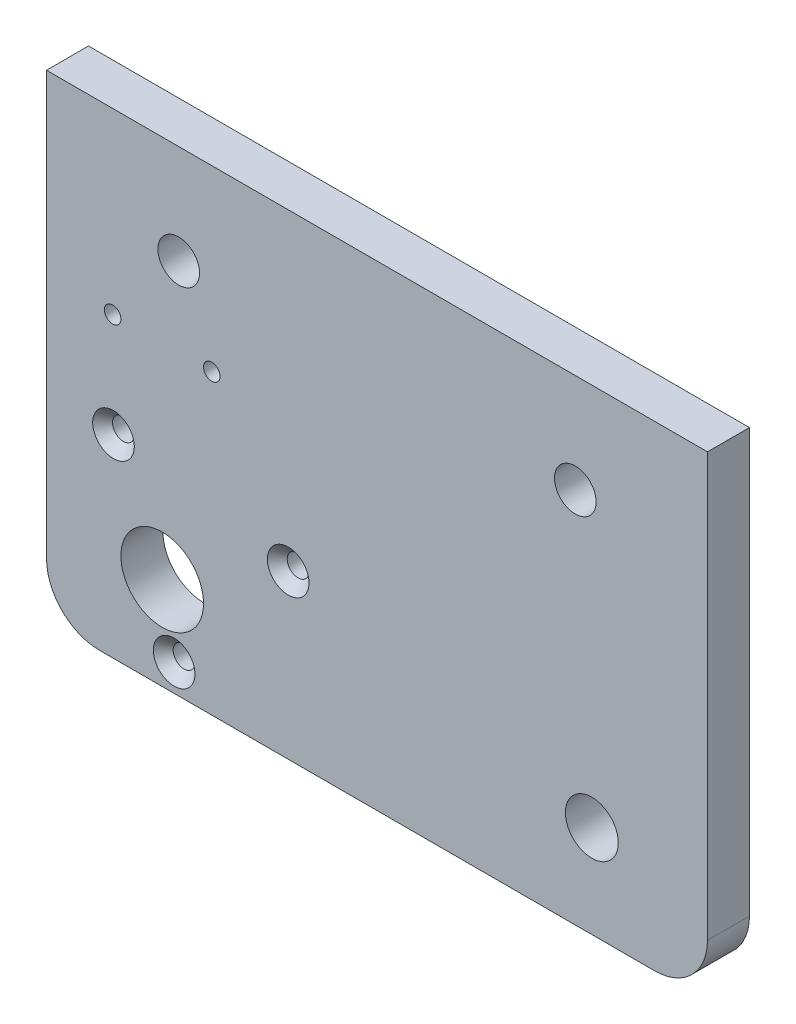
ISO-10303-21;
HEADER;
FILE_DESCRIPTION(('STEP AP214'),'2;1');
FILE_NAME('part.step','',(''),(''),'','','');
FILE_SCHEMA(('AUTOMOTIVE_DESIGN { 1 0 10303 214 1 1 1 1 }'));
ENDSEC;
DATA;
#1=APPLICATION_CONTEXT('core data for automotive mechanical design processes');
#2=APPLICATION_PROTOCOL_DEFINITION('international standard','automotive_design',2000,#1);
#3=PRODUCT_CONTEXT('',#1,'mechanical');
#4=PRODUCT('Part','Part','',(#3));
#5=PRODUCT_RELATED_PRODUCT_CATEGORY('part','',(#4));
#6=PRODUCT_DEFINITION_FORMATION('','',#4);
#7=PRODUCT_DEFINITION_CONTEXT('part definition',#1,'design');
#8=PRODUCT_DEFINITION('design','',#6,#7);
#9=PRODUCT_DEFINITION_SHAPE('','',#8);
#10=(LENGTH_UNIT() NAMED_UNIT(*) SI_UNIT(.MILLI.,.METRE.));
#11=(NAMED_UNIT(*) PLANE_ANGLE_UNIT() SI_UNIT($,.RADIAN.));
#12=(NAMED_UNIT(*) SI_UNIT($,.STERADIAN.) SOLID_ANGLE_UNIT());
#13=UNCERTAINTY_MEASURE_WITH_UNIT(LENGTH_MEASURE(1.E-05),#10,'distance_accuracy_value','');
#14=(GEOMETRIC_REPRESENTATION_CONTEXT(3) GLOBAL_UNCERTAINTY_ASSIGNED_CONTEXT((#13)) GLOBAL_UNIT_ASSIGNED_CONTEXT((#10,
#11,#12)) REPRESENTATION_CONTEXT('',''));
#15=CARTESIAN_POINT('',(0.,0.,0.));
#16=DIRECTION('',(0.,0.,1.));
#17=DIRECTION('',(1.,0.,0.));
#18=AXIS2_PLACEMENT_3D('',#15,#16,#17);
#19=CARTESIAN_POINT('',(0.,0.,6.35));
#20=DIRECTION('',(1.,0.,0.));
#21=DIRECTION('',(0.,0.,-1.));
#22=AXIS2_PLACEMENT_3D('',#19,#20,#21);
#23=PLANE('',#22);
#24=DIRECTION('',(0.,-1.,0.));
#25=VECTOR('',#24,1.);
#26=CARTESIAN_POINT('',(0.,0.,0.));
#27=LINE('',#26,#25);
#28=CARTESIAN_POINT('',(0.,72.,0.));
#29=VERTEX_POINT('',#28);
#30=CARTESIAN_POINT('',(0.,8.,0.));
#31=VERTEX_POINT('',#30);
#32=EDGE_CURVE('E117',#29,#31,#27,.T.);
#33=ORIENTED_EDGE('',*,*,#32,.T.);
#34=DIRECTION('',(0.,0.,-1.));
#35=VECTOR('',#34,1.);
#36=CARTESIAN_POINT('',(0.,8.,6.35));
#37=LINE('',#36,#35);
#38=CARTESIAN_POINT('',(0.,8.,6.35));
#39=VERTEX_POINT('',#38);
#40=EDGE_CURVE('E47',#31,#39,#37,.F.);
#41=ORIENTED_EDGE('',*,*,#40,.T.);
#42=DIRECTION('',(0.,-1.,0.));
#43=VECTOR('',#42,1.);
#44=CARTESIAN_POINT('',(0.,0.,6.35));
#45=LINE('',#44,#43);
#46=CARTESIAN_POINT('',(0.,72.,6.35));
#47=VERTEX_POINT('',#46);
#48=EDGE_CURVE('E124',#47,#39,#45,.T.);
#49=ORIENTED_EDGE('',*,*,#48,.F.);
#50=DIRECTION('',(0.,0.,-1.));
#51=VECTOR('',#50,1.);
#52=CARTESIAN_POINT('',(0.,72.,6.35));
#53=LINE('',#52,#51);
#54=EDGE_CURVE('E109',#47,#29,#53,.T.);
#55=ORIENTED_EDGE('',*,*,#54,.T.);
#56=EDGE_LOOP('',(#33,#41,#49,#55));
#57=FACE_BOUND('',#56,.T.);
#58=ADVANCED_FACE('F32',(#57),#23,.F.);
#59=CARTESIAN_POINT('',(0.,0.,6.35));
#60=DIRECTION('',(0.,1.,0.));
#61=DIRECTION('',(0.,0.,1.));
#62=AXIS2_PLACEMENT_3D('',#59,#60,#61);
#63=PLANE('',#62);
#64=DIRECTION('',(1.,0.,0.));
#65=VECTOR('',#64,1.);
#66=CARTESIAN_POINT('',(0.,0.,0.));
#67=LINE('',#66,#65);
#68=CARTESIAN_POINT('',(8.,0.,0.));
#69=VERTEX_POINT('',#68);
#70=CARTESIAN_POINT('',(92.,0.,0.));
#71=VERTEX_POINT('',#70);
#72=EDGE_CURVE('E119',#69,#71,#67,.T.);
#73=ORIENTED_EDGE('',*,*,#72,.T.);
#74=DIRECTION('',(0.,0.,-1.));
#75=VECTOR('',#74,1.);
#76=CARTESIAN_POINT('',(92.,0.,6.35));
#77=LINE('',#76,#75);
#78=CARTESIAN_POINT('',(92.,0.,6.35));
#79=VERTEX_POINT('',#78);
#80=EDGE_CURVE('E55',#71,#79,#77,.F.);
#81=ORIENTED_EDGE('',*,*,#80,.T.);
#82=DIRECTION('',(1.,0.,0.));
#83=VECTOR('',#82,1.);
#84=CARTESIAN_POINT('',(0.,0.,6.35));
#85=LINE('',#84,#83);
#86=CARTESIAN_POINT('',(8.,0.,6.35));
#87=VERTEX_POINT('',#86);
#88=EDGE_CURVE('E99',#87,#79,#85,.T.);
#89=ORIENTED_EDGE('',*,*,#88,.F.);
#90=DIRECTION('',(0.,0.,-1.));
#91=VECTOR('',#90,1.);
#92=CARTESIAN_POINT('',(8.,0.,6.35));
#93=LINE('',#92,#91);
#94=EDGE_CURVE('E131',#87,#69,#93,.T.);
#95=ORIENTED_EDGE('',*,*,#94,.T.);
#96=EDGE_LOOP('',(#73,#81,#89,#95));
#97=FACE_BOUND('',#96,.T.);
#98=ADVANCED_FACE('F196',(#97),#63,.F.);
#99=CARTESIAN_POINT('',(100.,0.,6.35));
#100=DIRECTION('',(-1.,0.,0.));
#101=DIRECTION('',(0.,0.,1.));
#102=AXIS2_PLACEMENT_3D('',#99,#100,#101);
#103=PLANE('',#102);
#104=DIRECTION('',(0.,1.,0.));
#105=VECTOR('',#104,1.);
#106=CARTESIAN_POINT('',(100.,0.,6.35));
#107=LINE('',#106,#105);
#108=CARTESIAN_POINT('',(100.,8.,6.35));
#109=VERTEX_POINT('',#108);
#110=CARTESIAN_POINT('',(100.,72.,6.35));
#111=VERTEX_POINT('',#110);
#112=EDGE_CURVE('E88',#109,#111,#107,.T.);
#113=ORIENTED_EDGE('',*,*,#112,.F.);
#114=DIRECTION('',(0.,0.,-1.));
#115=VECTOR('',#114,1.);
#116=CARTESIAN_POINT('',(100.,8.,6.35));
#117=LINE('',#116,#115);
#118=CARTESIAN_POINT('',(100.,8.,0.));
#119=VERTEX_POINT('',#118);
#120=EDGE_CURVE('E108',#109,#119,#117,.T.);
#121=ORIENTED_EDGE('',*,*,#120,.T.);
#122=DIRECTION('',(0.,1.,0.));
#123=VECTOR('',#122,1.);
#124=CARTESIAN_POINT('',(100.,0.,0.));
#125=LINE('',#124,#123);
#126=CARTESIAN_POINT('',(100.,72.,0.));
#127=VERTEX_POINT('',#126);
#128=EDGE_CURVE('E105',#119,#127,#125,.T.);
#129=ORIENTED_EDGE('',*,*,#128,.T.);
#130=DIRECTION('',(0.,0.,-1.));
#131=VECTOR('',#130,1.);
#132=CARTESIAN_POINT('',(100.,72.,6.35));
#133=LINE('',#132,#131);
#134=EDGE_CURVE('E102',#111,#127,#133,.T.);
#135=ORIENTED_EDGE('',*,*,#134,.F.);
#136=EDGE_LOOP('',(#113,#121,#129,#135));
#137=FACE_BOUND('',#136,.T.);
#138=ADVANCED_FACE('F103',(#137),#103,.F.);
#139=CARTESIAN_POINT('',(0.,72.,6.35));
#140=DIRECTION('',(0.,-1.,0.));
#141=DIRECTION('',(0.,0.,-1.));
#142=AXIS2_PLACEMENT_3D('',#139,#140,#141);
#143=PLANE('',#142);
#144=DIRECTION('',(-1.,0.,0.));
#145=VECTOR('',#144,1.);
#146=CARTESIAN_POINT('',(0.,72.,0.));
#147=LINE('',#146,#145);
#148=EDGE_CURVE('E123',#127,#29,#147,.T.);
#149=ORIENTED_EDGE('',*,*,#148,.T.);
#150=ORIENTED_EDGE('',*,*,#54,.F.);
#151=DIRECTION('',(-1.,0.,0.));
#152=VECTOR('',#151,1.);
#153=CARTESIAN_POINT('',(0.,72.,6.35));
#154=LINE('',#153,#152);
#155=EDGE_CURVE('E92',#111,#47,#154,.T.);
#156=ORIENTED_EDGE('',*,*,#155,.F.);
#157=ORIENTED_EDGE('',*,*,#134,.T.);
#158=EDGE_LOOP('',(#149,#150,#156,#157));
#159=FACE_BOUND('',#158,.T.);
#160=ADVANCED_FACE('F111',(#159),#143,.F.);
#161=CARTESIAN_POINT('',(0.,0.,6.35));
#162=DIRECTION('',(0.,0.,-1.));
#163=DIRECTION('',(-1.,0.,0.));
#164=AXIS2_PLACEMENT_3D('',#161,#162,#163);
#165=PLANE('',#164);
#166=CARTESIAN_POINT('',(19.3084532461626,4.09738247569258,6.35));
#167=DIRECTION('',(0.,0.,-1.));
#168=DIRECTION('',(-1.,0.,0.));
#169=AXIS2_PLACEMENT_3D('',#166,#167,#168);
#170=CIRCLE('',#169,3.15000000000001);
#171=CARTESIAN_POINT('',(16.1584532461626,4.09738247569258,6.35));
#172=VERTEX_POINT('',#171);
#173=EDGE_CURVE('E11',#172,#172,#170,.T.);
#174=ORIENTED_EDGE('',*,*,#173,.T.);
#175=EDGE_LOOP('',(#174));
#176=FACE_BOUND('',#175,.T.);
#177=CARTESIAN_POINT('',(36.5652356221816,24.6632148689297,6.35));
#178=DIRECTION('',(0.,0.,-1.));
#179=DIRECTION('',(-1.,0.,0.));
#180=AXIS2_PLACEMENT_3D('',#177,#178,#179);
#181=CIRCLE('',#180,3.15000000000001);
#182=CARTESIAN_POINT('',(33.4152356221816,24.6632148689297,6.35));
#183=VERTEX_POINT('',#182);
#184=EDGE_CURVE('E40',#183,#183,#181,.T.);
#185=ORIENTED_EDGE('',*,*,#184,.T.);
#186=EDGE_LOOP('',(#185));
#187=FACE_BOUND('',#186,.T.);
#188=CARTESIAN_POINT('',(10.1263111316559,29.3251105975232,6.35));
#189=DIRECTION('',(0.,0.,-1.));
#190=DIRECTION('',(-1.,0.,0.));
#191=AXIS2_PLACEMENT_3D('',#188,#189,#190);
#192=CIRCLE('',#191,3.15000000000001);
#193=CARTESIAN_POINT('',(6.97631113165584,29.3251105975232,6.35));
#194=VERTEX_POINT('',#193);
#195=EDGE_CURVE('E166',#194,#194,#192,.T.);
#196=ORIENTED_EDGE('',*,*,#195,.T.);
#197=EDGE_LOOP('',(#196));
#198=FACE_BOUND('',#197,.T.);
#199=CARTESIAN_POINT('',(82.5,14.,6.35));
#200=DIRECTION('',(0.,0.,1.));
#201=DIRECTION('',(1.,0.,0.));
#202=AXIS2_PLACEMENT_3D('',#199,#200,#201);
#203=CIRCLE('',#202,4.00000000000001);
#204=CARTESIAN_POINT('',(86.5,14.,6.35));
#205=VERTEX_POINT('',#204);
#206=EDGE_CURVE('E392',#205,#205,#203,.T.);
#207=ORIENTED_EDGE('',*,*,#206,.F.);
#208=EDGE_LOOP('',(#207));
#209=FACE_BOUND('',#208,.T.);
#210=CARTESIAN_POINT('',(80.,57.,6.35));
#211=DIRECTION('',(0.,0.,1.));
#212=DIRECTION('',(1.,0.,0.));
#213=AXIS2_PLACEMENT_3D('',#210,#211,#212);
#214=CIRCLE('',#213,3.15);
#215=CARTESIAN_POINT('',(83.15,57.,6.35));
#216=VERTEX_POINT('',#215);
#217=EDGE_CURVE('E396',#216,#216,#214,.T.);
#218=ORIENTED_EDGE('',*,*,#217,.F.);
#219=EDGE_LOOP('',(#218));
#220=FACE_BOUND('',#219,.T.);
#221=CARTESIAN_POINT('',(20.,57.,6.35));
#222=DIRECTION('',(0.,0.,1.));
#223=DIRECTION('',(1.,0.,0.));
#224=AXIS2_PLACEMENT_3D('',#221,#222,#223);
#225=CIRCLE('',#224,3.15);
#226=CARTESIAN_POINT('',(23.15,57.,6.35));
#227=VERTEX_POINT('',#226);
#228=EDGE_CURVE('E400',#227,#227,#225,.T.);
#229=ORIENTED_EDGE('',*,*,#228,.F.);
#230=EDGE_LOOP('',(#229));
#231=FACE_BOUND('',#230,.T.);
#232=CARTESIAN_POINT('',(10.,45.,6.35));
#233=DIRECTION('',(0.,0.,1.));
#234=DIRECTION('',(1.,0.,0.));
#235=AXIS2_PLACEMENT_3D('',#232,#233,#234);
#236=CIRCLE('',#235,1.25);
#237=CARTESIAN_POINT('',(11.25,45.,6.35));
#238=VERTEX_POINT('',#237);
#239=EDGE_CURVE('E404',#238,#238,#236,.T.);
#240=ORIENTED_EDGE('',*,*,#239,.F.);
#241=EDGE_LOOP('',(#240));
#242=FACE_BOUND('',#241,.T.);
#243=CARTESIAN_POINT('',(25.,45.,6.35));
#244=DIRECTION('',(0.,0.,1.));
#245=DIRECTION('',(1.,0.,0.));
#246=AXIS2_PLACEMENT_3D('',#243,#244,#245);
#247=CIRCLE('',#246,1.25);
#248=CARTESIAN_POINT('',(26.25,45.,6.35));
#249=VERTEX_POINT('',#248);
#250=EDGE_CURVE('E408',#249,#249,#247,.T.);
#251=ORIENTED_EDGE('',*,*,#250,.F.);
#252=EDGE_LOOP('',(#251));
#253=FACE_BOUND('',#252,.T.);
#254=CARTESIAN_POINT('',(17.5,14.,6.35));
#255=DIRECTION('',(0.,0.,1.));
#256=DIRECTION('',(1.,0.,0.));
#257=AXIS2_PLACEMENT_3D('',#254,#255,#256);
#258=CIRCLE('',#257,6.25);
#259=CARTESIAN_POINT('',(23.75,14.,6.35));
#260=VERTEX_POINT('',#259);
#261=EDGE_CURVE('E120',#260,#260,#258,.T.);
#262=ORIENTED_EDGE('',*,*,#261,.F.);
#263=EDGE_LOOP('',(#262));
#264=FACE_BOUND('',#263,.T.);
#265=ORIENTED_EDGE('',*,*,#88,.T.);
#266=CARTESIAN_POINT('',(92.,8.,6.35));
#267=DIRECTION('',(0.,0.,-1.));
#268=DIRECTION('',(-1.,0.,0.));
#269=AXIS2_PLACEMENT_3D('',#266,#267,#268);
#270=CIRCLE('',#269,8.);
#271=EDGE_CURVE('E95',#79,#109,#270,.F.);
#272=ORIENTED_EDGE('',*,*,#271,.T.);
#273=ORIENTED_EDGE('',*,*,#112,.T.);
#274=ORIENTED_EDGE('',*,*,#155,.T.);
#275=ORIENTED_EDGE('',*,*,#48,.T.);
#276=CARTESIAN_POINT('',(8.,8.,6.35));
#277=DIRECTION('',(0.,0.,-1.));
#278=DIRECTION('',(-1.,0.,0.));
#279=AXIS2_PLACEMENT_3D('',#276,#277,#278);
#280=CIRCLE('',#279,8.);
#281=EDGE_CURVE('E135',#39,#87,#280,.F.);
#282=ORIENTED_EDGE('',*,*,#281,.T.);
#283=EDGE_LOOP('',(#265,#272,#273,#274,#275,#282));
#284=FACE_BOUND('',#283,.T.);
#285=ADVANCED_FACE('F90',(#176,#187,#198,#209,#220,#231,#242,#253,#264,#284),#165,.F.);
#286=CARTESIAN_POINT('',(0.,0.,0.));
#287=DIRECTION('',(0.,0.,-1.));
#288=DIRECTION('',(-1.,0.,0.));
#289=AXIS2_PLACEMENT_3D('',#286,#287,#288);
#290=PLANE('',#289);
#291=CARTESIAN_POINT('',(19.3084532461626,4.09738247569258,0.));
#292=DIRECTION('',(0.,0.,-1.));
#293=DIRECTION('',(-1.,0.,0.));
#294=AXIS2_PLACEMENT_3D('',#291,#292,#293);
#295=CIRCLE('',#294,3.15);
#296=CARTESIAN_POINT('',(16.1584532461626,4.09738247569258,0.));
#297=VERTEX_POINT('',#296);
#298=EDGE_CURVE('E145',#297,#297,#295,.F.);
#299=ORIENTED_EDGE('',*,*,#298,.T.);
#300=EDGE_LOOP('',(#299));
#301=FACE_BOUND('',#300,.T.);
#302=CARTESIAN_POINT('',(10.1263111316559,29.3251105975232,0.));
#303=DIRECTION('',(0.,0.,-1.));
#304=DIRECTION('',(-1.,0.,0.));
#305=AXIS2_PLACEMENT_3D('',#302,#303,#304);
#306=CIRCLE('',#305,3.14999999999997);
#307=CARTESIAN_POINT('',(6.97631113165588,29.3251105975232,0.));
#308=VERTEX_POINT('',#307);
#309=EDGE_CURVE('E142',#308,#308,#306,.F.);
#310=ORIENTED_EDGE('',*,*,#309,.T.);
#311=EDGE_LOOP('',(#310));
#312=FACE_BOUND('',#311,.T.);
#313=CARTESIAN_POINT('',(36.5652356221816,24.6632148689297,0.));
#314=DIRECTION('',(0.,0.,-1.));
#315=DIRECTION('',(-1.,0.,0.));
#316=AXIS2_PLACEMENT_3D('',#313,#314,#315);
#317=CIRCLE('',#316,3.15);
#318=CARTESIAN_POINT('',(33.4152356221816,24.6632148689297,0.));
#319=VERTEX_POINT('',#318);
#320=EDGE_CURVE('E139',#319,#319,#317,.F.);
#321=ORIENTED_EDGE('',*,*,#320,.T.);
#322=EDGE_LOOP('',(#321));
#323=FACE_BOUND('',#322,.T.);
#324=CARTESIAN_POINT('',(82.5,14.,0.));
#325=DIRECTION('',(0.,0.,1.));
#326=DIRECTION('',(1.,0.,0.));
#327=AXIS2_PLACEMENT_3D('',#324,#325,#326);
#328=CIRCLE('',#327,4.00000000000001);
#329=CARTESIAN_POINT('',(86.5,14.,0.));
#330=VERTEX_POINT('',#329);
#331=EDGE_CURVE('E438',#330,#330,#328,.T.);
#332=ORIENTED_EDGE('',*,*,#331,.T.);
#333=EDGE_LOOP('',(#332));
#334=FACE_BOUND('',#333,.T.);
#335=CARTESIAN_POINT('',(80.,57.,0.));
#336=DIRECTION('',(0.,0.,1.));
#337=DIRECTION('',(1.,0.,0.));
#338=AXIS2_PLACEMENT_3D('',#335,#336,#337);
#339=CIRCLE('',#338,3.15);
#340=CARTESIAN_POINT('',(83.15,57.,0.));
#341=VERTEX_POINT('',#340);
#342=EDGE_CURVE('E434',#341,#341,#339,.T.);
#343=ORIENTED_EDGE('',*,*,#342,.T.);
#344=EDGE_LOOP('',(#343));
#345=FACE_BOUND('',#344,.T.);
#346=CARTESIAN_POINT('',(20.,57.,0.));
#347=DIRECTION('',(0.,0.,1.));
#348=DIRECTION('',(1.,0.,0.));
#349=AXIS2_PLACEMENT_3D('',#346,#347,#348);
#350=CIRCLE('',#349,3.15);
#351=CARTESIAN_POINT('',(23.15,57.,0.));
#352=VERTEX_POINT('',#351);
#353=EDGE_CURVE('E430',#352,#352,#350,.T.);
#354=ORIENTED_EDGE('',*,*,#353,.T.);
#355=EDGE_LOOP('',(#354));
#356=FACE_BOUND('',#355,.T.);
#357=CARTESIAN_POINT('',(10.,45.,0.));
#358=DIRECTION('',(0.,0.,1.));
#359=DIRECTION('',(1.,0.,0.));
#360=AXIS2_PLACEMENT_3D('',#357,#358,#359);
#361=CIRCLE('',#360,1.25);
#362=CARTESIAN_POINT('',(11.25,45.,0.));
#363=VERTEX_POINT('',#362);
#364=EDGE_CURVE('E426',#363,#363,#361,.T.);
#365=ORIENTED_EDGE('',*,*,#364,.T.);
#366=EDGE_LOOP('',(#365));
#367=FACE_BOUND('',#366,.T.);
#368=CARTESIAN_POINT('',(25.,45.,0.));
#369=DIRECTION('',(0.,0.,1.));
#370=DIRECTION('',(1.,0.,0.));
#371=AXIS2_PLACEMENT_3D('',#368,#369,#370);
#372=CIRCLE('',#371,1.25);
#373=CARTESIAN_POINT('',(26.25,45.,0.));
#374=VERTEX_POINT('',#373);
#375=EDGE_CURVE('E416',#374,#374,#372,.T.);
#376=ORIENTED_EDGE('',*,*,#375,.T.);
#377=EDGE_LOOP('',(#376));
#378=FACE_BOUND('',#377,.T.);
#379=CARTESIAN_POINT('',(17.5,14.,0.));
#380=DIRECTION('',(0.,0.,1.));
#381=DIRECTION('',(1.,0.,0.));
#382=AXIS2_PLACEMENT_3D('',#379,#380,#381);
#383=CIRCLE('',#382,6.25);
#384=CARTESIAN_POINT('',(23.75,14.,0.));
#385=VERTEX_POINT('',#384);
#386=EDGE_CURVE('E411',#385,#385,#383,.T.);
#387=ORIENTED_EDGE('',*,*,#386,.T.);
#388=EDGE_LOOP('',(#387));
#389=FACE_BOUND('',#388,.T.);
#390=ORIENTED_EDGE('',*,*,#128,.F.);
#391=CARTESIAN_POINT('',(92.,8.,0.));
#392=DIRECTION('',(0.,0.,-1.));
#393=DIRECTION('',(-1.,0.,0.));
#394=AXIS2_PLACEMENT_3D('',#391,#392,#393);
#395=CIRCLE('',#394,8.);
#396=EDGE_CURVE('E129',#119,#71,#395,.T.);
#397=ORIENTED_EDGE('',*,*,#396,.T.);
#398=ORIENTED_EDGE('',*,*,#72,.F.);
#399=CARTESIAN_POINT('',(8.,8.,0.));
#400=DIRECTION('',(0.,0.,-1.));
#401=DIRECTION('',(-1.,0.,0.));
#402=AXIS2_PLACEMENT_3D('',#399,#400,#401);
#403=CIRCLE('',#402,8.);
#404=EDGE_CURVE('E127',#69,#31,#403,.T.);
#405=ORIENTED_EDGE('',*,*,#404,.T.);
#406=ORIENTED_EDGE('',*,*,#32,.F.);
#407=ORIENTED_EDGE('',*,*,#148,.F.);
#408=EDGE_LOOP('',(#390,#397,#398,#405,#406,#407));
#409=FACE_BOUND('',#408,.T.);
#410=ADVANCED_FACE('F208',(#301,#312,#323,#334,#345,#356,#367,#378,#389,#409),#290,.T.);
#411=CARTESIAN_POINT('',(92.,8.,6.35));
#412=DIRECTION('',(0.,0.,-1.));
#413=DIRECTION('',(-1.,0.,0.));
#414=AXIS2_PLACEMENT_3D('',#411,#412,#413);
#415=CYLINDRICAL_SURFACE('',#414,8.);
#416=ORIENTED_EDGE('',*,*,#271,.F.);
#417=ORIENTED_EDGE('',*,*,#80,.F.);
#418=ORIENTED_EDGE('',*,*,#396,.F.);
#419=ORIENTED_EDGE('',*,*,#120,.F.);
#420=EDGE_LOOP('',(#416,#417,#418,#419));
#421=FACE_BOUND('',#420,.T.);
#422=ADVANCED_FACE('F204',(#421),#415,.T.);
#423=CARTESIAN_POINT('',(8.,8.,6.35));
#424=DIRECTION('',(0.,0.,-1.));
#425=DIRECTION('',(-1.,0.,0.));
#426=AXIS2_PLACEMENT_3D('',#423,#424,#425);
#427=CYLINDRICAL_SURFACE('',#426,8.);
#428=ORIENTED_EDGE('',*,*,#281,.F.);
#429=ORIENTED_EDGE('',*,*,#40,.F.);
#430=ORIENTED_EDGE('',*,*,#404,.F.);
#431=ORIENTED_EDGE('',*,*,#94,.F.);
#432=EDGE_LOOP('',(#428,#429,#430,#431));
#433=FACE_BOUND('',#432,.T.);
#434=ADVANCED_FACE('F207',(#433),#427,.T.);
#435=CARTESIAN_POINT('',(17.5,14.,6.35));
#436=DIRECTION('',(0.,0.,-1.));
#437=DIRECTION('',(-1.,0.,0.));
#438=AXIS2_PLACEMENT_3D('',#435,#436,#437);
#439=CYLINDRICAL_SURFACE('',#438,6.25);
#440=ORIENTED_EDGE('',*,*,#261,.T.);
#441=EDGE_LOOP('',(#440));
#442=FACE_BOUND('',#441,.T.);
#443=ORIENTED_EDGE('',*,*,#386,.F.);
#444=EDGE_LOOP('',(#443));
#445=FACE_BOUND('',#444,.T.);
#446=ADVANCED_FACE('F211',(#442,#445),#439,.F.);
#447=CARTESIAN_POINT('',(25.,45.,6.35));
#448=DIRECTION('',(0.,0.,-1.));
#449=DIRECTION('',(-1.,0.,0.));
#450=AXIS2_PLACEMENT_3D('',#447,#448,#449);
#451=CYLINDRICAL_SURFACE('',#450,1.25);
#452=ORIENTED_EDGE('',*,*,#250,.T.);
#453=EDGE_LOOP('',(#452));
#454=FACE_BOUND('',#453,.T.);
#455=ORIENTED_EDGE('',*,*,#375,.F.);
#456=EDGE_LOOP('',(#455));
#457=FACE_BOUND('',#456,.T.);
#458=ADVANCED_FACE('F291',(#454,#457),#451,.F.);
#459=CARTESIAN_POINT('',(10.,45.,6.35));
#460=DIRECTION('',(0.,0.,-1.));
#461=DIRECTION('',(-1.,0.,0.));
#462=AXIS2_PLACEMENT_3D('',#459,#460,#461);
#463=CYLINDRICAL_SURFACE('',#462,1.25);
#464=ORIENTED_EDGE('',*,*,#239,.T.);
#465=EDGE_LOOP('',(#464));
#466=FACE_BOUND('',#465,.T.);
#467=ORIENTED_EDGE('',*,*,#364,.F.);
#468=EDGE_LOOP('',(#467));
#469=FACE_BOUND('',#468,.T.);
#470=ADVANCED_FACE('F299',(#466,#469),#463,.F.);
#471=CARTESIAN_POINT('',(20.,57.,6.35));
#472=DIRECTION('',(0.,0.,-1.));
#473=DIRECTION('',(-1.,0.,0.));
#474=AXIS2_PLACEMENT_3D('',#471,#472,#473);
#475=CYLINDRICAL_SURFACE('',#474,3.15);
#476=ORIENTED_EDGE('',*,*,#228,.T.);
#477=EDGE_LOOP('',(#476));
#478=FACE_BOUND('',#477,.T.);
#479=ORIENTED_EDGE('',*,*,#353,.F.);
#480=EDGE_LOOP('',(#479));
#481=FACE_BOUND('',#480,.T.);
#482=ADVANCED_FACE('F307',(#478,#481),#475,.F.);
#483=CARTESIAN_POINT('',(80.,57.,6.35));
#484=DIRECTION('',(0.,0.,-1.));
#485=DIRECTION('',(-1.,0.,0.));
#486=AXIS2_PLACEMENT_3D('',#483,#484,#485);
#487=CYLINDRICAL_SURFACE('',#486,3.15);
#488=ORIENTED_EDGE('',*,*,#217,.T.);
#489=EDGE_LOOP('',(#488));
#490=FACE_BOUND('',#489,.T.);
#491=ORIENTED_EDGE('',*,*,#342,.F.);
#492=EDGE_LOOP('',(#491));
#493=FACE_BOUND('',#492,.T.);
#494=ADVANCED_FACE('F316',(#490,#493),#487,.F.);
#495=CARTESIAN_POINT('',(82.5,14.,6.35));
#496=DIRECTION('',(0.,0.,-1.));
#497=DIRECTION('',(-1.,0.,0.));
#498=AXIS2_PLACEMENT_3D('',#495,#496,#497);
#499=CYLINDRICAL_SURFACE('',#498,4.00000000000001);
#500=ORIENTED_EDGE('',*,*,#206,.T.);
#501=EDGE_LOOP('',(#500));
#502=FACE_BOUND('',#501,.T.);
#503=ORIENTED_EDGE('',*,*,#331,.F.);
#504=EDGE_LOOP('',(#503));
#505=FACE_BOUND('',#504,.T.);
#506=ADVANCED_FACE('F325',(#502,#505),#499,.F.);
#507=CARTESIAN_POINT('',(10.1263111316559,29.3251105975232,0.));
#508=DIRECTION('',(0.,0.,1.));
#509=DIRECTION('',(1.,0.,0.));
#510=AXIS2_PLACEMENT_3D('',#507,#508,#509);
#511=CYLINDRICAL_SURFACE('',#510,1.65);
#512=CARTESIAN_POINT('',(10.1263111316559,29.3251105975232,1.49999999999998));
#513=DIRECTION('',(0.,0.,-1.));
#514=DIRECTION('',(-1.,0.,0.));
#515=AXIS2_PLACEMENT_3D('',#512,#513,#514);
#516=CIRCLE('',#515,1.65);
#517=CARTESIAN_POINT('',(8.47631113165585,29.3251105975232,1.49999999999998));
#518=VERTEX_POINT('',#517);
#519=EDGE_CURVE('E157',#518,#518,#516,.T.);
#520=ORIENTED_EDGE('',*,*,#519,.T.);
#521=EDGE_LOOP('',(#520));
#522=FACE_BOUND('',#521,.T.);
#523=CARTESIAN_POINT('',(10.1263111316559,29.3251105975232,4.84999999999999));
#524=DIRECTION('',(0.,0.,-1.));
#525=DIRECTION('',(-1.,0.,0.));
#526=AXIS2_PLACEMENT_3D('',#523,#524,#525);
#527=CIRCLE('',#526,1.65);
#528=CARTESIAN_POINT('',(8.47631113165585,29.3251105975232,4.84999999999999));
#529=VERTEX_POINT('',#528);
#530=EDGE_CURVE('E154',#529,#529,#527,.F.);
#531=ORIENTED_EDGE('',*,*,#530,.T.);
#532=EDGE_LOOP('',(#531));
#533=FACE_BOUND('',#532,.T.);
#534=ADVANCED_FACE('F192',(#522,#533),#511,.F.);
#535=CARTESIAN_POINT('',(19.3084532461626,4.09738247569258,0.));
#536=DIRECTION('',(0.,0.,1.));
#537=DIRECTION('',(1.,0.,0.));
#538=AXIS2_PLACEMENT_3D('',#535,#536,#537);
#539=CYLINDRICAL_SURFACE('',#538,1.65);
#540=CARTESIAN_POINT('',(19.3084532461626,4.09738247569258,1.50000000000001));
#541=DIRECTION('',(0.,0.,-1.));
#542=DIRECTION('',(-1.,0.,0.));
#543=AXIS2_PLACEMENT_3D('',#540,#541,#542);
#544=CIRCLE('',#543,1.65);
#545=CARTESIAN_POINT('',(17.6584532461626,4.09738247569258,1.50000000000001));
#546=VERTEX_POINT('',#545);
#547=EDGE_CURVE('E151',#546,#546,#544,.T.);
#548=ORIENTED_EDGE('',*,*,#547,.T.);
#549=EDGE_LOOP('',(#548));
#550=FACE_BOUND('',#549,.T.);
#551=CARTESIAN_POINT('',(19.3084532461626,4.09738247569258,4.84999999999999));
#552=DIRECTION('',(0.,0.,-1.));
#553=DIRECTION('',(-1.,0.,0.));
#554=AXIS2_PLACEMENT_3D('',#551,#552,#553);
#555=CIRCLE('',#554,1.65);
#556=CARTESIAN_POINT('',(17.6584532461626,4.09738247569258,4.84999999999999));
#557=VERTEX_POINT('',#556);
#558=EDGE_CURVE('E148',#557,#557,#555,.F.);
#559=ORIENTED_EDGE('',*,*,#558,.T.);
#560=EDGE_LOOP('',(#559));
#561=FACE_BOUND('',#560,.T.);
#562=ADVANCED_FACE('F182',(#550,#561),#539,.F.);
#563=CARTESIAN_POINT('',(36.5652356221816,24.6632148689297,0.));
#564=DIRECTION('',(0.,0.,1.));
#565=DIRECTION('',(1.,0.,0.));
#566=AXIS2_PLACEMENT_3D('',#563,#564,#565);
#567=CYLINDRICAL_SURFACE('',#566,1.65);
#568=CARTESIAN_POINT('',(36.5652356221816,24.6632148689297,1.5));
#569=DIRECTION('',(0.,0.,-1.));
#570=DIRECTION('',(-1.,0.,0.));
#571=AXIS2_PLACEMENT_3D('',#568,#569,#570);
#572=CIRCLE('',#571,1.65);
#573=CARTESIAN_POINT('',(34.9152356221816,24.6632148689297,1.5));
#574=VERTEX_POINT('',#573);
#575=EDGE_CURVE('E163',#574,#574,#572,.T.);
#576=ORIENTED_EDGE('',*,*,#575,.T.);
#577=EDGE_LOOP('',(#576));
#578=FACE_BOUND('',#577,.T.);
#579=CARTESIAN_POINT('',(36.5652356221816,24.6632148689297,4.85));
#580=DIRECTION('',(0.,0.,-1.));
#581=DIRECTION('',(-1.,0.,0.));
#582=AXIS2_PLACEMENT_3D('',#579,#580,#581);
#583=CIRCLE('',#582,1.65);
#584=CARTESIAN_POINT('',(34.9152356221816,24.6632148689297,4.85));
#585=VERTEX_POINT('',#584);
#586=EDGE_CURVE('E160',#585,#585,#583,.F.);
#587=ORIENTED_EDGE('',*,*,#586,.T.);
#588=EDGE_LOOP('',(#587));
#589=FACE_BOUND('',#588,.T.);
#590=ADVANCED_FACE('F179',(#578,#589),#567,.F.);
#591=CARTESIAN_POINT('',(19.3084532461626,4.09738247569258,0.));
#592=DIRECTION('',(0.,0.,-1.));
#593=DIRECTION('',(-1.,0.,0.));
#594=AXIS2_PLACEMENT_3D('',#591,#592,#593);
#595=CONICAL_SURFACE('',#594,3.15,0.785398163397447);
#596=ORIENTED_EDGE('',*,*,#547,.F.);
#597=EDGE_LOOP('',(#596));
#598=FACE_BOUND('',#597,.T.);
#599=ORIENTED_EDGE('',*,*,#298,.F.);
#600=EDGE_LOOP('',(#599));
#601=FACE_BOUND('',#600,.T.);
#602=ADVANCED_FACE('F181',(#598,#601),#595,.F.);
#603=CARTESIAN_POINT('',(10.1263111316559,29.3251105975232,0.));
#604=DIRECTION('',(0.,0.,-1.));
#605=DIRECTION('',(-1.,0.,0.));
#606=AXIS2_PLACEMENT_3D('',#603,#604,#605);
#607=CONICAL_SURFACE('',#606,3.14999999999997,0.785398163397446);
#608=CARTESIAN_POINT('',(8.47631113165585,29.3251105975232,1.49999999999998));
#609=CARTESIAN_POINT('',(8.46068613165585,29.3251105975232,1.48437499999998));
#610=CARTESIAN_POINT('',(8.44506113165585,29.3251105975232,1.46874999999998));
#611=CARTESIAN_POINT('',(8.41381113165585,29.3251105975232,1.43749999999998));
#612=CARTESIAN_POINT('',(8.39818613165586,29.3251105975232,1.42187499999998));
#613=CARTESIAN_POINT('',(8.36693613165586,29.3251105975232,1.39062499999998));
#614=CARTESIAN_POINT('',(8.35131113165586,29.3251105975232,1.37499999999998));
#615=CARTESIAN_POINT('',(8.32006113165586,29.3251105975232,1.34374999999998));
#616=CARTESIAN_POINT('',(8.30443613165586,29.3251105975232,1.32812499999998));
#617=CARTESIAN_POINT('',(8.27318613165586,29.3251105975232,1.29687499999998));
#618=CARTESIAN_POINT('',(8.25756113165586,29.3251105975232,1.28124999999998));
#619=CARTESIAN_POINT('',(8.22631113165586,29.3251105975232,1.24999999999998));
#620=CARTESIAN_POINT('',(8.21068613165586,29.3251105975232,1.23437499999998));
#621=CARTESIAN_POINT('',(8.17943613165586,29.3251105975232,1.20312499999998));
#622=CARTESIAN_POINT('',(8.16381113165586,29.3251105975232,1.18749999999998));
#623=CARTESIAN_POINT('',(8.13256113165586,29.3251105975232,1.15624999999999));
#624=CARTESIAN_POINT('',(8.11693613165586,29.3251105975232,1.14062499999999));
#625=CARTESIAN_POINT('',(8.08568613165586,29.3251105975232,1.10937499999999));
#626=CARTESIAN_POINT('',(8.07006113165586,29.3251105975232,1.09374999999999));
#627=CARTESIAN_POINT('',(8.03881113165586,29.3251105975232,1.06249999999999));
#628=CARTESIAN_POINT('',(8.02318613165586,29.3251105975232,1.04687499999999));
#629=CARTESIAN_POINT('',(7.99193613165586,29.3251105975232,1.01562499999999));
#630=CARTESIAN_POINT('',(7.97631113165586,29.3251105975232,0.999999999999987));
#631=CARTESIAN_POINT('',(7.94506113165586,29.3251105975232,0.968749999999988));
#632=CARTESIAN_POINT('',(7.92943613165586,29.3251105975232,0.953124999999988));
#633=CARTESIAN_POINT('',(7.89818613165586,29.3251105975232,0.921874999999988));
#634=CARTESIAN_POINT('',(7.88256113165586,29.3251105975232,0.906249999999988));
#635=CARTESIAN_POINT('',(7.85131113165586,29.3251105975232,0.874999999999989));
#636=CARTESIAN_POINT('',(7.83568613165586,29.3251105975232,0.859374999999989));
#637=CARTESIAN_POINT('',(7.80443613165586,29.3251105975232,0.828124999999989));
#638=CARTESIAN_POINT('',(7.78881113165586,29.3251105975232,0.81249999999999));
#639=CARTESIAN_POINT('',(7.75756113165586,29.3251105975232,0.78124999999999));
#640=CARTESIAN_POINT('',(7.74193613165587,29.3251105975232,0.76562499999999));
#641=CARTESIAN_POINT('',(7.71068613165587,29.3251105975232,0.73437499999999));
#642=CARTESIAN_POINT('',(7.69506113165587,29.3251105975232,0.718749999999991));
#643=CARTESIAN_POINT('',(7.66381113165587,29.3251105975232,0.687499999999991));
#644=CARTESIAN_POINT('',(7.64818613165587,29.3251105975232,0.671874999999991));
#645=CARTESIAN_POINT('',(7.61693613165587,29.3251105975232,0.640624999999992));
#646=CARTESIAN_POINT('',(7.60131113165587,29.3251105975232,0.624999999999992));
#647=CARTESIAN_POINT('',(7.57006113165587,29.3251105975232,0.593749999999993));
#648=CARTESIAN_POINT('',(7.55443613165587,29.3251105975232,0.578124999999993));
#649=CARTESIAN_POINT('',(7.52318613165587,29.3251105975232,0.546874999999993));
#650=CARTESIAN_POINT('',(7.50756113165587,29.3251105975232,0.531249999999993));
#651=CARTESIAN_POINT('',(7.47631113165587,29.3251105975232,0.499999999999994));
#652=CARTESIAN_POINT('',(7.46068613165587,29.3251105975232,0.484374999999994));
#653=CARTESIAN_POINT('',(7.42943613165587,29.3251105975232,0.453124999999994));
#654=CARTESIAN_POINT('',(7.41381113165587,29.3251105975232,0.437499999999995));
#655=CARTESIAN_POINT('',(7.38256113165587,29.3251105975232,0.406249999999995));
#656=CARTESIAN_POINT('',(7.36693613165587,29.3251105975232,0.390624999999995));
#657=CARTESIAN_POINT('',(7.33568613165587,29.3251105975232,0.359374999999995));
#658=CARTESIAN_POINT('',(7.32006113165587,29.3251105975232,0.343749999999996));
#659=CARTESIAN_POINT('',(7.28881113165587,29.3251105975232,0.312499999999996));
#660=CARTESIAN_POINT('',(7.27318613165587,29.3251105975232,0.296874999999996));
#661=CARTESIAN_POINT('',(7.24193613165587,29.3251105975232,0.265624999999996));
#662=CARTESIAN_POINT('',(7.22631113165588,29.3251105975232,0.249999999999997));
#663=CARTESIAN_POINT('',(7.19506113165588,29.3251105975232,0.218749999999997));
#664=CARTESIAN_POINT('',(7.17943613165588,29.3251105975232,0.203124999999997));
#665=CARTESIAN_POINT('',(7.14818613165588,29.3251105975232,0.171874999999998));
#666=CARTESIAN_POINT('',(7.13256113165588,29.3251105975232,0.156249999999998));
#667=CARTESIAN_POINT('',(7.10131113165588,29.3251105975232,0.124999999999998));
#668=CARTESIAN_POINT('',(7.08568613165588,29.3251105975232,0.109374999999999));
#669=CARTESIAN_POINT('',(7.05443613165588,29.3251105975232,0.078124999999999));
#670=CARTESIAN_POINT('',(7.03881113165588,29.3251105975232,0.0624999999999992));
#671=CARTESIAN_POINT('',(7.00756113165588,29.3251105975232,0.0312499999999996));
#672=CARTESIAN_POINT('',(6.99193613165588,29.3251105975232,0.0156249999999998));
#673=CARTESIAN_POINT('',(6.97631113165588,29.3251105975232,0.));
#674=B_SPLINE_CURVE_WITH_KNOTS('',3,(#608,#609,#610,#611,#612,#613,#614,#615,#616,#617,#618,
#619,#620,#621,#622,#623,#624,#625,#626,#627,#628,#629,#630,#631,#632,#633,#634,#635,#636,#637,
#638,#639,#640,#641,#642,#643,#644,#645,#646,#647,#648,#649,#650,#651,#652,#653,#654,#655,#656,
#657,#658,#659,#660,#661,#662,#663,#664,#665,#666,#667,#668,#669,#670,#671,#672,#673),
.UNSPECIFIED.,.F.,.F.,(4,2,2,2,2,2,2,2,2,2,2,2,2,2,2,2,2,2,2,2,2,2,2,2,2,2,2,2,2,2,2,2,4),(0.,
0.0662912607362384,0.132582521472476,0.198873782208714,0.265165042944951,0.33145630368119,
0.397747564417427,0.464038825153665,0.530330085889902,0.596621346626141,0.662912607362378,
0.729203868098617,0.795495128834854,0.861786389571092,0.928077650307329,0.994368911043568,
1.06066017177981,1.12695143251604,1.19324269325228,1.25953395398852,1.32582521472476,
1.39211647546099,1.45840773619723,1.52469899693347,1.59099025766971,1.65728151840595,
1.72357277914218,1.78986403987842,1.85615530061466,1.9224465613509,1.98873782208713,
2.05502908282337,2.12132034355961),.UNSPECIFIED.);
#675=EDGE_CURVE('BSEAM189',#518,#308,#674,.T.);
#676=ORIENTED_EDGE('',*,*,#519,.F.);
#677=ORIENTED_EDGE('',*,*,#309,.F.);
#678=ORIENTED_EDGE('',*,*,#675,.T.);
#679=ORIENTED_EDGE('',*,*,#675,.F.);
#680=EDGE_LOOP('',(#676,#678,#677,#679));
#681=FACE_BOUND('',#680,.T.);
#682=ADVANCED_FACE('F189',(#681),#607,.F.);
#683=CARTESIAN_POINT('',(36.5652356221816,24.6632148689297,0.));
#684=DIRECTION('',(0.,0.,-1.));
#685=DIRECTION('',(-1.,0.,0.));
#686=AXIS2_PLACEMENT_3D('',#683,#684,#685);
#687=CONICAL_SURFACE('',#686,3.15,0.785398163397447);
#688=ORIENTED_EDGE('',*,*,#575,.F.);
#689=EDGE_LOOP('',(#688));
#690=FACE_BOUND('',#689,.T.);
#691=ORIENTED_EDGE('',*,*,#320,.F.);
#692=EDGE_LOOP('',(#691));
#693=FACE_BOUND('',#692,.T.);
#694=ADVANCED_FACE('F216',(#690,#693),#687,.F.);
#695=CARTESIAN_POINT('',(19.3084532461626,4.09738247569258,4.84999999999999));
#696=DIRECTION('',(0.,0.,1.));
#697=DIRECTION('',(1.,0.,0.));
#698=AXIS2_PLACEMENT_3D('',#695,#696,#697);
#699=CONICAL_SURFACE('',#698,1.65,0.785398163397451);
#700=ORIENTED_EDGE('',*,*,#173,.F.);
#701=EDGE_LOOP('',(#700));
#702=FACE_BOUND('',#701,.T.);
#703=ORIENTED_EDGE('',*,*,#558,.F.);
#704=EDGE_LOOP('',(#703));
#705=FACE_BOUND('',#704,.T.);
#706=ADVANCED_FACE('F176',(#702,#705),#699,.F.);
#707=CARTESIAN_POINT('',(36.5652356221816,24.6632148689297,4.85));
#708=DIRECTION('',(0.,0.,1.));
#709=DIRECTION('',(1.,0.,0.));
#710=AXIS2_PLACEMENT_3D('',#707,#708,#709);
#711=CONICAL_SURFACE('',#710,1.65,0.785398163397451);
#712=ORIENTED_EDGE('',*,*,#184,.F.);
#713=EDGE_LOOP('',(#712));
#714=FACE_BOUND('',#713,.T.);
#715=ORIENTED_EDGE('',*,*,#586,.F.);
#716=EDGE_LOOP('',(#715));
#717=FACE_BOUND('',#716,.T.);
#718=ADVANCED_FACE('F173',(#714,#717),#711,.F.);
#719=CARTESIAN_POINT('',(10.1263111316559,29.3251105975232,4.84999999999999));
#720=DIRECTION('',(0.,0.,1.));
#721=DIRECTION('',(1.,0.,0.));
#722=AXIS2_PLACEMENT_3D('',#719,#720,#721);
#723=CONICAL_SURFACE('',#722,1.65,0.785398163397451);
#724=ORIENTED_EDGE('',*,*,#195,.F.);
#725=EDGE_LOOP('',(#724));
#726=FACE_BOUND('',#725,.T.);
#727=ORIENTED_EDGE('',*,*,#530,.F.);
#728=EDGE_LOOP('',(#727));
#729=FACE_BOUND('',#728,.T.);
#730=ADVANCED_FACE('F34',(#726,#729),#723,.F.);
#731=CLOSED_SHELL('',(#58,#98,#138,#160,#285,#410,#422,#434,#446,#458,#470,#482,#494,#506,#534,
#562,#590,#602,#682,#694,#706,#718,#730));
#732=MANIFOLD_SOLID_BREP('B2',#731);
#733=ADVANCED_BREP_SHAPE_REPRESENTATION('',(#18,#732),#14);
#734=SHAPE_DEFINITION_REPRESENTATION(#9,#733);
ENDSEC;
END-ISO-10303-21;
